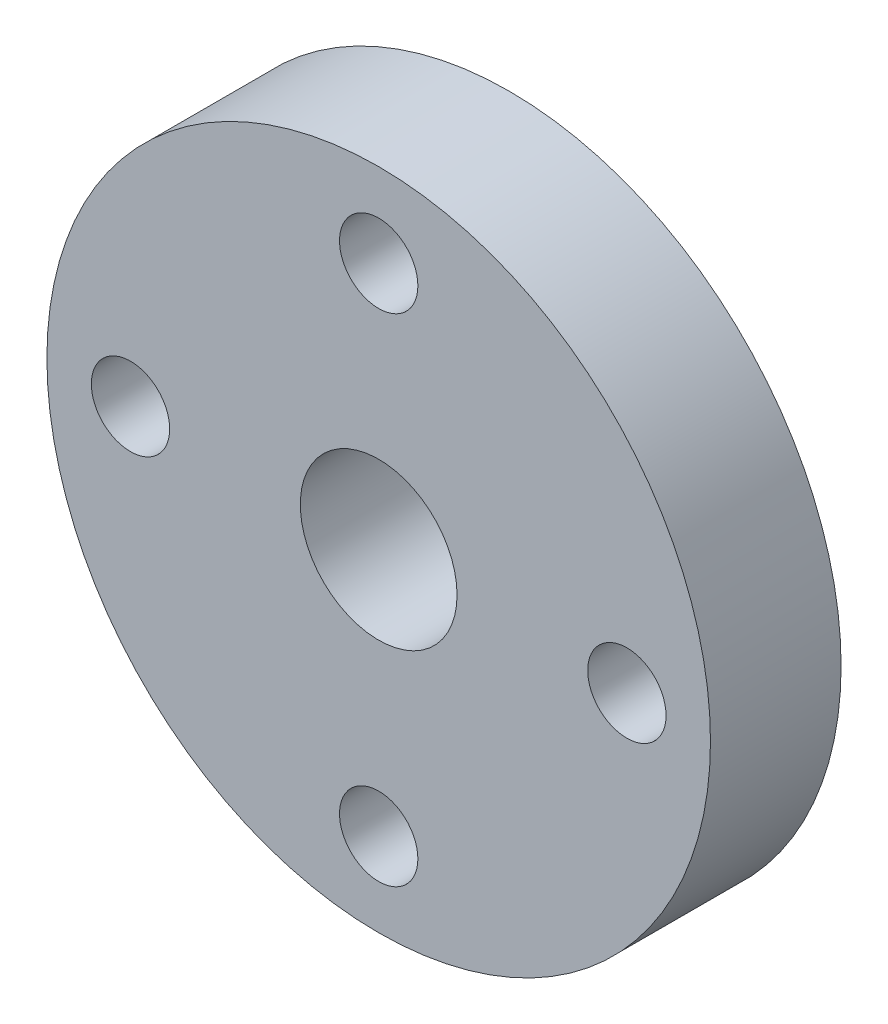
ISO-10303-21;
HEADER;
FILE_DESCRIPTION(('STEP AP214'),'2;1');
FILE_NAME('part.step','',(''),(''),'','','');
FILE_SCHEMA(('AUTOMOTIVE_DESIGN { 1 0 10303 214 1 1 1 1 }'));
ENDSEC;
DATA;
#1=APPLICATION_CONTEXT('core data for automotive mechanical design processes');
#2=APPLICATION_PROTOCOL_DEFINITION('international standard','automotive_design',2000,#1);
#3=PRODUCT_CONTEXT('',#1,'mechanical');
#4=PRODUCT('Part','Part','',(#3));
#5=PRODUCT_RELATED_PRODUCT_CATEGORY('part','',(#4));
#6=PRODUCT_DEFINITION_FORMATION('','',#4);
#7=PRODUCT_DEFINITION_CONTEXT('part definition',#1,'design');
#8=PRODUCT_DEFINITION('design','',#6,#7);
#9=PRODUCT_DEFINITION_SHAPE('','',#8);
#10=(LENGTH_UNIT() NAMED_UNIT(*) SI_UNIT(.MILLI.,.METRE.));
#11=(NAMED_UNIT(*) PLANE_ANGLE_UNIT() SI_UNIT($,.RADIAN.));
#12=(NAMED_UNIT(*) SI_UNIT($,.STERADIAN.) SOLID_ANGLE_UNIT());
#13=UNCERTAINTY_MEASURE_WITH_UNIT(LENGTH_MEASURE(1.E-05),#10,'distance_accuracy_value','');
#14=(GEOMETRIC_REPRESENTATION_CONTEXT(3) GLOBAL_UNCERTAINTY_ASSIGNED_CONTEXT((#13)) GLOBAL_UNIT_ASSIGNED_CONTEXT((#10,
#11,#12)) REPRESENTATION_CONTEXT('',''));
#15=CARTESIAN_POINT('',(0.,0.,0.));
#16=DIRECTION('',(0.,0.,1.));
#17=DIRECTION('',(1.,0.,0.));
#18=AXIS2_PLACEMENT_3D('',#15,#16,#17);
#19=CARTESIAN_POINT('',(0.,0.,0.));
#20=DIRECTION('',(0.,0.,1.));
#21=DIRECTION('',(1.,0.,0.));
#22=AXIS2_PLACEMENT_3D('',#19,#20,#21);
#23=PLANE('',#22);
#24=CARTESIAN_POINT('',(0.,0.,0.));
#25=DIRECTION('',(0.,0.,1.));
#26=DIRECTION('',(1.,0.,0.));
#27=AXIS2_PLACEMENT_3D('',#24,#25,#26);
#28=CIRCLE('',#27,6.);
#29=CARTESIAN_POINT('',(6.,0.,0.));
#30=VERTEX_POINT('',#29);
#31=EDGE_CURVE('E34',#30,#30,#28,.T.);
#32=ORIENTED_EDGE('',*,*,#31,.F.);
#33=EDGE_LOOP('',(#32));
#34=FACE_BOUND('',#33,.T.);
#35=CARTESIAN_POINT('',(0.,0.,0.));
#36=DIRECTION('',(0.,0.,1.));
#37=DIRECTION('',(1.,0.,0.));
#38=AXIS2_PLACEMENT_3D('',#35,#36,#37);
#39=CIRCLE('',#38,3.);
#40=CARTESIAN_POINT('',(3.,0.,0.));
#41=VERTEX_POINT('',#40);
#42=EDGE_CURVE('E41',#41,#41,#39,.T.);
#43=ORIENTED_EDGE('',*,*,#42,.T.);
#44=EDGE_LOOP('',(#43));
#45=FACE_BOUND('',#44,.T.);
#46=ADVANCED_FACE('F30',(#34,#45),#23,.F.);
#47=CARTESIAN_POINT('',(0.,0.,4.2));
#48=DIRECTION('',(0.,0.,-1.));
#49=DIRECTION('',(-1.,0.,0.));
#50=AXIS2_PLACEMENT_3D('',#47,#48,#49);
#51=CYLINDRICAL_SURFACE('',#50,6.);
#52=CARTESIAN_POINT('',(0.,0.,4.2));
#53=DIRECTION('',(0.,0.,1.));
#54=DIRECTION('',(1.,0.,0.));
#55=AXIS2_PLACEMENT_3D('',#52,#53,#54);
#56=CIRCLE('',#55,6.);
#57=CARTESIAN_POINT('',(6.,0.,4.2));
#58=VERTEX_POINT('',#57);
#59=EDGE_CURVE('E10',#58,#58,#56,.T.);
#60=ORIENTED_EDGE('',*,*,#59,.F.);
#61=EDGE_LOOP('',(#60));
#62=FACE_BOUND('',#61,.T.);
#63=ORIENTED_EDGE('',*,*,#31,.T.);
#64=EDGE_LOOP('',(#63));
#65=FACE_BOUND('',#64,.T.);
#66=ADVANCED_FACE('F32',(#62,#65),#51,.T.);
#67=CARTESIAN_POINT('',(0.,0.,4.2));
#68=DIRECTION('',(0.,0.,-1.));
#69=DIRECTION('',(-1.,0.,0.));
#70=AXIS2_PLACEMENT_3D('',#67,#68,#69);
#71=CYLINDRICAL_SURFACE('',#70,3.);
#72=ORIENTED_EDGE('',*,*,#42,.F.);
#73=EDGE_LOOP('',(#72));
#74=FACE_BOUND('',#73,.T.);
#75=CARTESIAN_POINT('',(0.,0.,9.2));
#76=DIRECTION('',(0.,0.,1.));
#77=DIRECTION('',(1.,0.,0.));
#78=AXIS2_PLACEMENT_3D('',#75,#76,#77);
#79=CIRCLE('',#78,3.);
#80=CARTESIAN_POINT('',(3.,0.,9.2));
#81=VERTEX_POINT('',#80);
#82=EDGE_CURVE('E49',#81,#81,#79,.T.);
#83=ORIENTED_EDGE('',*,*,#82,.T.);
#84=EDGE_LOOP('',(#83));
#85=FACE_BOUND('',#84,.T.);
#86=ADVANCED_FACE('F104',(#74,#85),#71,.F.);
#87=CARTESIAN_POINT('',(0.,0.,4.2));
#88=DIRECTION('',(0.,0.,1.));
#89=DIRECTION('',(1.,0.,0.));
#90=AXIS2_PLACEMENT_3D('',#87,#88,#89);
#91=PLANE('',#90);
#92=CARTESIAN_POINT('',(0.,-9.5,4.2));
#93=DIRECTION('',(0.,0.,1.));
#94=DIRECTION('',(1.,0.,0.));
#95=AXIS2_PLACEMENT_3D('',#92,#93,#94);
#96=CIRCLE('',#95,1.5);
#97=CARTESIAN_POINT('',(1.5,-9.5,4.2));
#98=VERTEX_POINT('',#97);
#99=EDGE_CURVE('E58',#98,#98,#96,.T.);
#100=ORIENTED_EDGE('',*,*,#99,.T.);
#101=EDGE_LOOP('',(#100));
#102=FACE_BOUND('',#101,.T.);
#103=CARTESIAN_POINT('',(9.5,0.,4.2));
#104=DIRECTION('',(0.,0.,1.));
#105=DIRECTION('',(1.,0.,0.));
#106=AXIS2_PLACEMENT_3D('',#103,#104,#105);
#107=CIRCLE('',#106,1.5);
#108=CARTESIAN_POINT('',(11.,0.,4.2));
#109=VERTEX_POINT('',#108);
#110=EDGE_CURVE('E70',#109,#109,#107,.T.);
#111=ORIENTED_EDGE('',*,*,#110,.T.);
#112=EDGE_LOOP('',(#111));
#113=FACE_BOUND('',#112,.T.);
#114=CARTESIAN_POINT('',(-9.5,0.,4.2));
#115=DIRECTION('',(0.,0.,1.));
#116=DIRECTION('',(1.,0.,0.));
#117=AXIS2_PLACEMENT_3D('',#114,#115,#116);
#118=CIRCLE('',#117,1.5);
#119=CARTESIAN_POINT('',(-8.,0.,4.2));
#120=VERTEX_POINT('',#119);
#121=EDGE_CURVE('E64',#120,#120,#118,.T.);
#122=ORIENTED_EDGE('',*,*,#121,.T.);
#123=EDGE_LOOP('',(#122));
#124=FACE_BOUND('',#123,.T.);
#125=CARTESIAN_POINT('',(0.,9.49515398955023,4.2));
#126=DIRECTION('',(0.,0.,1.));
#127=DIRECTION('',(1.,0.,0.));
#128=AXIS2_PLACEMENT_3D('',#125,#126,#127);
#129=CIRCLE('',#128,1.5);
#130=CARTESIAN_POINT('',(1.5,9.49515398955023,4.2));
#131=VERTEX_POINT('',#130);
#132=EDGE_CURVE('E54',#131,#131,#129,.T.);
#133=ORIENTED_EDGE('',*,*,#132,.T.);
#134=EDGE_LOOP('',(#133));
#135=FACE_BOUND('',#134,.T.);
#136=CARTESIAN_POINT('',(0.,0.,4.2));
#137=DIRECTION('',(0.,0.,1.));
#138=DIRECTION('',(1.,0.,0.));
#139=AXIS2_PLACEMENT_3D('',#136,#137,#138);
#140=CIRCLE('',#139,12.7);
#141=CARTESIAN_POINT('',(12.7,0.,4.2));
#142=VERTEX_POINT('',#141);
#143=EDGE_CURVE('E46',#142,#142,#140,.T.);
#144=ORIENTED_EDGE('',*,*,#143,.F.);
#145=EDGE_LOOP('',(#144));
#146=FACE_BOUND('',#145,.T.);
#147=ORIENTED_EDGE('',*,*,#59,.T.);
#148=EDGE_LOOP('',(#147));
#149=FACE_BOUND('',#148,.T.);
#150=ADVANCED_FACE('F79',(#102,#113,#124,#135,#146,#149),#91,.F.);
#151=CARTESIAN_POINT('',(0.,0.,9.2));
#152=DIRECTION('',(0.,0.,1.));
#153=DIRECTION('',(1.,0.,0.));
#154=AXIS2_PLACEMENT_3D('',#151,#152,#153);
#155=PLANE('',#154);
#156=CARTESIAN_POINT('',(0.,-9.5,9.2));
#157=DIRECTION('',(0.,0.,1.));
#158=DIRECTION('',(1.,0.,0.));
#159=AXIS2_PLACEMENT_3D('',#156,#157,#158);
#160=CIRCLE('',#159,1.5);
#161=CARTESIAN_POINT('',(1.5,-9.5,9.2));
#162=VERTEX_POINT('',#161);
#163=EDGE_CURVE('E73',#162,#162,#160,.T.);
#164=ORIENTED_EDGE('',*,*,#163,.F.);
#165=EDGE_LOOP('',(#164));
#166=FACE_BOUND('',#165,.T.);
#167=CARTESIAN_POINT('',(9.5,0.,9.2));
#168=DIRECTION('',(0.,0.,1.));
#169=DIRECTION('',(1.,0.,0.));
#170=AXIS2_PLACEMENT_3D('',#167,#168,#169);
#171=CIRCLE('',#170,1.5);
#172=CARTESIAN_POINT('',(11.,0.,9.2));
#173=VERTEX_POINT('',#172);
#174=EDGE_CURVE('E67',#173,#173,#171,.T.);
#175=ORIENTED_EDGE('',*,*,#174,.F.);
#176=EDGE_LOOP('',(#175));
#177=FACE_BOUND('',#176,.T.);
#178=CARTESIAN_POINT('',(-9.5,0.,9.2));
#179=DIRECTION('',(0.,0.,1.));
#180=DIRECTION('',(1.,0.,0.));
#181=AXIS2_PLACEMENT_3D('',#178,#179,#180);
#182=CIRCLE('',#181,1.5);
#183=CARTESIAN_POINT('',(-8.,0.,9.2));
#184=VERTEX_POINT('',#183);
#185=EDGE_CURVE('E61',#184,#184,#182,.T.);
#186=ORIENTED_EDGE('',*,*,#185,.F.);
#187=EDGE_LOOP('',(#186));
#188=FACE_BOUND('',#187,.T.);
#189=CARTESIAN_POINT('',(0.,9.49515398955023,9.2));
#190=DIRECTION('',(0.,0.,1.));
#191=DIRECTION('',(1.,0.,0.));
#192=AXIS2_PLACEMENT_3D('',#189,#190,#191);
#193=CIRCLE('',#192,1.5);
#194=CARTESIAN_POINT('',(1.5,9.49515398955023,9.2));
#195=VERTEX_POINT('',#194);
#196=EDGE_CURVE('E55',#195,#195,#193,.T.);
#197=ORIENTED_EDGE('',*,*,#196,.F.);
#198=EDGE_LOOP('',(#197));
#199=FACE_BOUND('',#198,.T.);
#200=CARTESIAN_POINT('',(0.,0.,9.2));
#201=DIRECTION('',(0.,0.,1.));
#202=DIRECTION('',(1.,0.,0.));
#203=AXIS2_PLACEMENT_3D('',#200,#201,#202);
#204=CIRCLE('',#203,12.7);
#205=CARTESIAN_POINT('',(12.7,0.,9.2));
#206=VERTEX_POINT('',#205);
#207=EDGE_CURVE('E45',#206,#206,#204,.T.);
#208=ORIENTED_EDGE('',*,*,#207,.T.);
#209=EDGE_LOOP('',(#208));
#210=FACE_BOUND('',#209,.T.);
#211=ORIENTED_EDGE('',*,*,#82,.F.);
#212=EDGE_LOOP('',(#211));
#213=FACE_BOUND('',#212,.T.);
#214=ADVANCED_FACE('F89',(#166,#177,#188,#199,#210,#213),#155,.T.);
#215=CARTESIAN_POINT('',(0.,0.,9.2));
#216=DIRECTION('',(0.,0.,-1.));
#217=DIRECTION('',(-1.,0.,0.));
#218=AXIS2_PLACEMENT_3D('',#215,#216,#217);
#219=CYLINDRICAL_SURFACE('',#218,12.7);
#220=ORIENTED_EDGE('',*,*,#207,.F.);
#221=EDGE_LOOP('',(#220));
#222=FACE_BOUND('',#221,.T.);
#223=ORIENTED_EDGE('',*,*,#143,.T.);
#224=EDGE_LOOP('',(#223));
#225=FACE_BOUND('',#224,.T.);
#226=ADVANCED_FACE('F92',(#222,#225),#219,.T.);
#227=CARTESIAN_POINT('',(0.,9.49515398955023,4.2));
#228=DIRECTION('',(0.,0.,1.));
#229=DIRECTION('',(1.,0.,0.));
#230=AXIS2_PLACEMENT_3D('',#227,#228,#229);
#231=CYLINDRICAL_SURFACE('',#230,1.5);
#232=ORIENTED_EDGE('',*,*,#132,.F.);
#233=EDGE_LOOP('',(#232));
#234=FACE_BOUND('',#233,.T.);
#235=ORIENTED_EDGE('',*,*,#196,.T.);
#236=EDGE_LOOP('',(#235));
#237=FACE_BOUND('',#236,.T.);
#238=ADVANCED_FACE('F142',(#234,#237),#231,.F.);
#239=CARTESIAN_POINT('',(-9.5,0.,4.2));
#240=DIRECTION('',(0.,0.,1.));
#241=DIRECTION('',(1.,0.,0.));
#242=AXIS2_PLACEMENT_3D('',#239,#240,#241);
#243=CYLINDRICAL_SURFACE('',#242,1.5);
#244=ORIENTED_EDGE('',*,*,#121,.F.);
#245=EDGE_LOOP('',(#244));
#246=FACE_BOUND('',#245,.T.);
#247=ORIENTED_EDGE('',*,*,#185,.T.);
#248=EDGE_LOOP('',(#247));
#249=FACE_BOUND('',#248,.T.);
#250=ADVANCED_FACE('F162',(#246,#249),#243,.F.);
#251=CARTESIAN_POINT('',(9.5,0.,4.2));
#252=DIRECTION('',(0.,0.,1.));
#253=DIRECTION('',(1.,0.,0.));
#254=AXIS2_PLACEMENT_3D('',#251,#252,#253);
#255=CYLINDRICAL_SURFACE('',#254,1.5);
#256=ORIENTED_EDGE('',*,*,#110,.F.);
#257=EDGE_LOOP('',(#256));
#258=FACE_BOUND('',#257,.T.);
#259=ORIENTED_EDGE('',*,*,#174,.T.);
#260=EDGE_LOOP('',(#259));
#261=FACE_BOUND('',#260,.T.);
#262=ADVANCED_FACE('F85',(#258,#261),#255,.F.);
#263=CARTESIAN_POINT('',(0.,-9.5,4.2));
#264=DIRECTION('',(0.,0.,1.));
#265=DIRECTION('',(1.,0.,0.));
#266=AXIS2_PLACEMENT_3D('',#263,#264,#265);
#267=CYLINDRICAL_SURFACE('',#266,1.5);
#268=ORIENTED_EDGE('',*,*,#99,.F.);
#269=EDGE_LOOP('',(#268));
#270=FACE_BOUND('',#269,.T.);
#271=ORIENTED_EDGE('',*,*,#163,.T.);
#272=EDGE_LOOP('',(#271));
#273=FACE_BOUND('',#272,.T.);
#274=ADVANCED_FACE('F82',(#270,#273),#267,.F.);
#275=CLOSED_SHELL('',(#46,#66,#86,#150,#214,#226,#238,#250,#262,#274));
#276=MANIFOLD_SOLID_BREP('B2',#275);
#277=ADVANCED_BREP_SHAPE_REPRESENTATION('',(#18,#276),#14);
#278=SHAPE_DEFINITION_REPRESENTATION(#9,#277);
ENDSEC;
END-ISO-10303-21;
